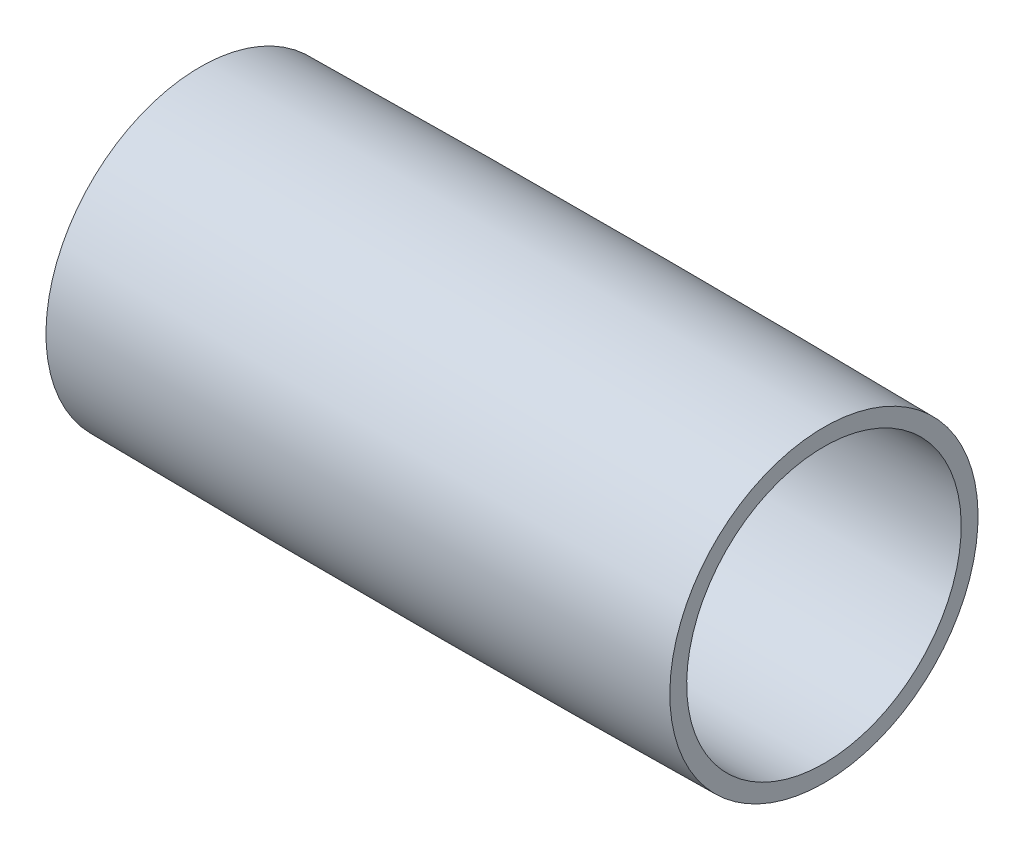
ISO-10303-21;
HEADER;
FILE_DESCRIPTION(('STEP AP214'),'2;1');
FILE_NAME('part.step','',(''),(''),'','','');
FILE_SCHEMA(('AUTOMOTIVE_DESIGN { 1 0 10303 214 1 1 1 1 }'));
ENDSEC;
DATA;
#1=APPLICATION_CONTEXT('core data for automotive mechanical design processes');
#2=APPLICATION_PROTOCOL_DEFINITION('international standard','automotive_design',2000,#1);
#3=PRODUCT_CONTEXT('',#1,'mechanical');
#4=PRODUCT('Part','Part','',(#3));
#5=PRODUCT_RELATED_PRODUCT_CATEGORY('part','',(#4));
#6=PRODUCT_DEFINITION_FORMATION('','',#4);
#7=PRODUCT_DEFINITION_CONTEXT('part definition',#1,'design');
#8=PRODUCT_DEFINITION('design','',#6,#7);
#9=PRODUCT_DEFINITION_SHAPE('','',#8);
#10=(LENGTH_UNIT() NAMED_UNIT(*) SI_UNIT(.MILLI.,.METRE.));
#11=(NAMED_UNIT(*) PLANE_ANGLE_UNIT() SI_UNIT($,.RADIAN.));
#12=(NAMED_UNIT(*) SI_UNIT($,.STERADIAN.) SOLID_ANGLE_UNIT());
#13=UNCERTAINTY_MEASURE_WITH_UNIT(LENGTH_MEASURE(1.E-05),#10,'distance_accuracy_value','');
#14=(GEOMETRIC_REPRESENTATION_CONTEXT(3) GLOBAL_UNCERTAINTY_ASSIGNED_CONTEXT((#13)) GLOBAL_UNIT_ASSIGNED_CONTEXT((#10,
#11,#12)) REPRESENTATION_CONTEXT('',''));
#15=CARTESIAN_POINT('',(0.,0.,0.));
#16=DIRECTION('',(0.,0.,1.));
#17=DIRECTION('',(1.,0.,0.));
#18=AXIS2_PLACEMENT_3D('',#15,#16,#17);
#19=CARTESIAN_POINT('',(0.,25.,0.));
#20=DIRECTION('',(1.,0.,0.));
#21=DIRECTION('',(0.,1.,0.));
#22=AXIS2_PLACEMENT_3D('',#19,#20,#21);
#23=PLANE('',#22);
#24=CARTESIAN_POINT('',(0.,0.,0.));
#25=DIRECTION('',(-1.,0.,0.));
#26=DIRECTION('',(0.,-1.,0.));
#27=AXIS2_PLACEMENT_3D('',#24,#25,#26);
#28=CIRCLE('',#27,22.);
#29=CARTESIAN_POINT('',(0.,-22.,0.));
#30=VERTEX_POINT('',#29);
#31=EDGE_CURVE('E10',#30,#30,#28,.T.);
#32=ORIENTED_EDGE('',*,*,#31,.F.);
#33=EDGE_LOOP('',(#32));
#34=FACE_BOUND('',#33,.T.);
#35=CARTESIAN_POINT('',(0.,0.,0.));
#36=DIRECTION('',(-1.,0.,0.));
#37=DIRECTION('',(0.,-1.,0.));
#38=AXIS2_PLACEMENT_3D('',#35,#36,#37);
#39=CIRCLE('',#38,24.7);
#40=CARTESIAN_POINT('',(0.,-24.7,0.));
#41=VERTEX_POINT('',#40);
#42=EDGE_CURVE('E47',#41,#41,#39,.T.);
#43=ORIENTED_EDGE('',*,*,#42,.T.);
#44=EDGE_LOOP('',(#43));
#45=FACE_BOUND('',#44,.T.);
#46=ADVANCED_FACE('F33',(#34,#45),#23,.F.);
#47=CARTESIAN_POINT('',(100.,25.,0.));
#48=DIRECTION('',(-1.,0.,0.));
#49=DIRECTION('',(0.,-1.,0.));
#50=AXIS2_PLACEMENT_3D('',#47,#48,#49);
#51=PLANE('',#50);
#52=CARTESIAN_POINT('',(100.,0.,0.));
#53=DIRECTION('',(-1.,0.,0.));
#54=DIRECTION('',(0.,-1.,0.));
#55=AXIS2_PLACEMENT_3D('',#52,#53,#54);
#56=CIRCLE('',#55,22.);
#57=CARTESIAN_POINT('',(100.,-22.,0.));
#58=VERTEX_POINT('',#57);
#59=EDGE_CURVE('E39',#58,#58,#56,.T.);
#60=ORIENTED_EDGE('',*,*,#59,.T.);
#61=EDGE_LOOP('',(#60));
#62=FACE_BOUND('',#61,.T.);
#63=CARTESIAN_POINT('',(100.,0.,0.));
#64=DIRECTION('',(-1.,0.,0.));
#65=DIRECTION('',(0.,-1.,0.));
#66=AXIS2_PLACEMENT_3D('',#63,#64,#65);
#67=CIRCLE('',#66,24.7000000000002);
#68=CARTESIAN_POINT('',(100.,-24.7000000000002,0.));
#69=VERTEX_POINT('',#68);
#70=EDGE_CURVE('E43',#69,#69,#67,.T.);
#71=ORIENTED_EDGE('',*,*,#70,.F.);
#72=EDGE_LOOP('',(#71));
#73=FACE_BOUND('',#72,.T.);
#74=ADVANCED_FACE('F62',(#62,#73),#51,.F.);
#75=CARTESIAN_POINT('',(0.,0.,0.));
#76=DIRECTION('',(-1.,0.,0.));
#77=DIRECTION('',(0.,-1.,0.));
#78=AXIS2_PLACEMENT_3D('',#75,#76,#77);
#79=CYLINDRICAL_SURFACE('',#78,22.);
#80=ORIENTED_EDGE('',*,*,#59,.F.);
#81=EDGE_LOOP('',(#80));
#82=FACE_BOUND('',#81,.T.);
#83=ORIENTED_EDGE('',*,*,#31,.T.);
#84=EDGE_LOOP('',(#83));
#85=FACE_BOUND('',#84,.T.);
#86=ADVANCED_FACE('F56',(#82,#85),#79,.F.);
#87=CARTESIAN_POINT('',(50.,0.,0.));
#88=DIRECTION('',(-1.,0.,0.));
#89=DIRECTION('',(0.,-1.,0.));
#90=AXIS2_PLACEMENT_3D('',#87,#88,#89);
#91=DEGENERATE_TOROIDAL_SURFACE('',#90,4141.81666666664,4166.81666666664,.F.);
#92=ORIENTED_EDGE('',*,*,#70,.T.);
#93=EDGE_LOOP('',(#92));
#94=FACE_BOUND('',#93,.T.);
#95=ORIENTED_EDGE('',*,*,#42,.F.);
#96=EDGE_LOOP('',(#95));
#97=FACE_BOUND('',#96,.T.);
#98=ADVANCED_FACE('F54',(#94,#97),#91,.F.);
#99=CLOSED_SHELL('',(#46,#74,#86,#98));
#100=MANIFOLD_SOLID_BREP('B2',#99);
#101=ADVANCED_BREP_SHAPE_REPRESENTATION('',(#18,#100),#14);
#102=SHAPE_DEFINITION_REPRESENTATION(#9,#101);
ENDSEC;
END-ISO-10303-21;
